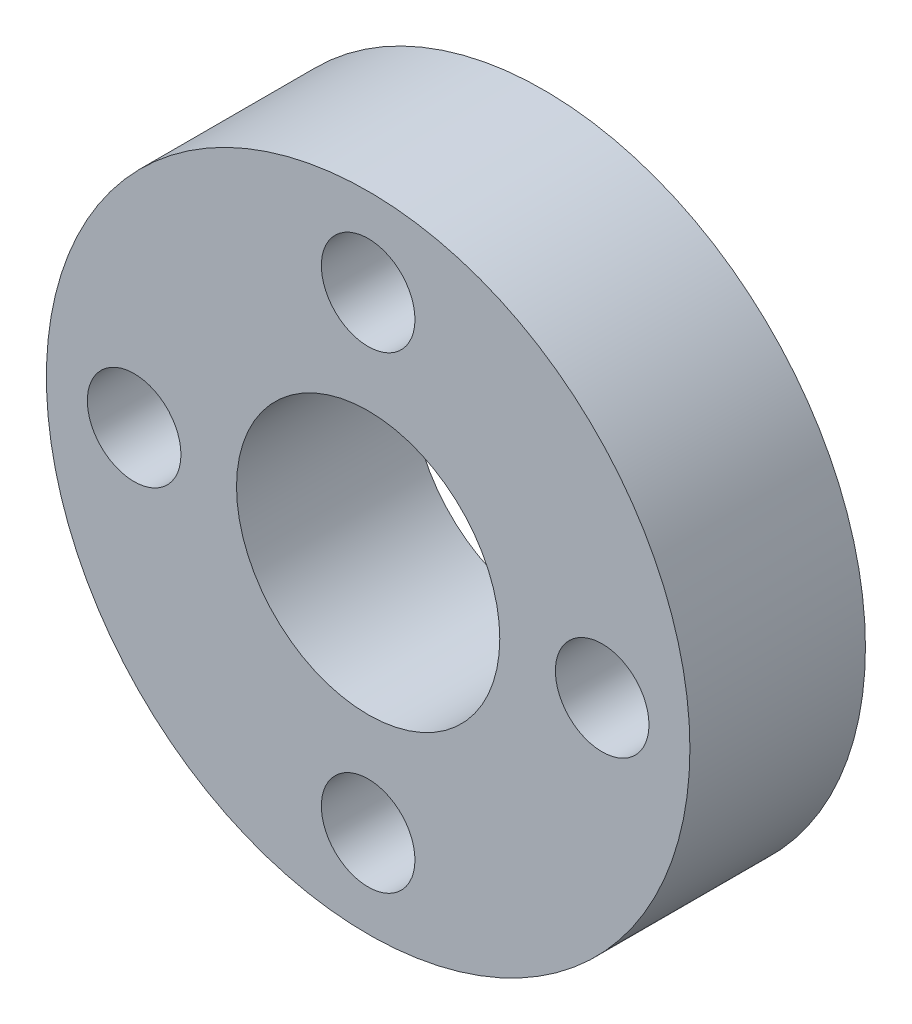
ISO-10303-21;
HEADER;
FILE_DESCRIPTION(('STEP AP214'),'2;1');
FILE_NAME('part.step','',(''),(''),'','','');
FILE_SCHEMA(('AUTOMOTIVE_DESIGN { 1 0 10303 214 1 1 1 1 }'));
ENDSEC;
DATA;
#1=APPLICATION_CONTEXT('core data for automotive mechanical design processes');
#2=APPLICATION_PROTOCOL_DEFINITION('international standard','automotive_design',2000,#1);
#3=PRODUCT_CONTEXT('',#1,'mechanical');
#4=PRODUCT('Part','Part','',(#3));
#5=PRODUCT_RELATED_PRODUCT_CATEGORY('part','',(#4));
#6=PRODUCT_DEFINITION_FORMATION('','',#4);
#7=PRODUCT_DEFINITION_CONTEXT('part definition',#1,'design');
#8=PRODUCT_DEFINITION('design','',#6,#7);
#9=PRODUCT_DEFINITION_SHAPE('','',#8);
#10=(LENGTH_UNIT() NAMED_UNIT(*) SI_UNIT(.MILLI.,.METRE.));
#11=(NAMED_UNIT(*) PLANE_ANGLE_UNIT() SI_UNIT($,.RADIAN.));
#12=(NAMED_UNIT(*) SI_UNIT($,.STERADIAN.) SOLID_ANGLE_UNIT());
#13=UNCERTAINTY_MEASURE_WITH_UNIT(LENGTH_MEASURE(1.E-05),#10,'distance_accuracy_value','');
#14=(GEOMETRIC_REPRESENTATION_CONTEXT(3) GLOBAL_UNCERTAINTY_ASSIGNED_CONTEXT((#13)) GLOBAL_UNIT_ASSIGNED_CONTEXT((#10,
#11,#12)) REPRESENTATION_CONTEXT('',''));
#15=CARTESIAN_POINT('',(0.,0.,0.));
#16=DIRECTION('',(0.,0.,1.));
#17=DIRECTION('',(1.,0.,0.));
#18=AXIS2_PLACEMENT_3D('',#15,#16,#17);
#19=CARTESIAN_POINT('',(0.,0.,6.));
#20=DIRECTION('',(0.,0.,1.));
#21=DIRECTION('',(1.,0.,0.));
#22=AXIS2_PLACEMENT_3D('',#19,#20,#21);
#23=PLANE('',#22);
#24=CARTESIAN_POINT('',(-8.,0.,6.));
#25=DIRECTION('',(0.,0.,1.));
#26=DIRECTION('',(1.,0.,0.));
#27=AXIS2_PLACEMENT_3D('',#24,#25,#26);
#28=CIRCLE('',#27,1.6);
#29=CARTESIAN_POINT('',(-6.4,0.,6.));
#30=VERTEX_POINT('',#29);
#31=EDGE_CURVE('E59',#30,#30,#28,.T.);
#32=ORIENTED_EDGE('',*,*,#31,.F.);
#33=EDGE_LOOP('',(#32));
#34=FACE_BOUND('',#33,.T.);
#35=CARTESIAN_POINT('',(8.,0.,6.));
#36=DIRECTION('',(0.,0.,1.));
#37=DIRECTION('',(1.,0.,0.));
#38=AXIS2_PLACEMENT_3D('',#35,#36,#37);
#39=CIRCLE('',#38,1.6);
#40=CARTESIAN_POINT('',(9.6,0.,6.));
#41=VERTEX_POINT('',#40);
#42=EDGE_CURVE('E47',#41,#41,#39,.T.);
#43=ORIENTED_EDGE('',*,*,#42,.F.);
#44=EDGE_LOOP('',(#43));
#45=FACE_BOUND('',#44,.T.);
#46=CARTESIAN_POINT('',(0.,0.,6.));
#47=DIRECTION('',(0.,0.,1.));
#48=DIRECTION('',(1.,0.,0.));
#49=AXIS2_PLACEMENT_3D('',#46,#47,#48);
#50=CIRCLE('',#49,11.);
#51=CARTESIAN_POINT('',(11.,0.,6.));
#52=VERTEX_POINT('',#51);
#53=EDGE_CURVE('E10',#52,#52,#50,.T.);
#54=ORIENTED_EDGE('',*,*,#53,.T.);
#55=EDGE_LOOP('',(#54));
#56=FACE_BOUND('',#55,.T.);
#57=CARTESIAN_POINT('',(0.,0.,6.));
#58=DIRECTION('',(0.,0.,1.));
#59=DIRECTION('',(1.,0.,0.));
#60=AXIS2_PLACEMENT_3D('',#57,#58,#59);
#61=CIRCLE('',#60,4.5);
#62=CARTESIAN_POINT('',(4.5,0.,6.));
#63=VERTEX_POINT('',#62);
#64=EDGE_CURVE('E42',#63,#63,#61,.T.);
#65=ORIENTED_EDGE('',*,*,#64,.F.);
#66=EDGE_LOOP('',(#65));
#67=FACE_BOUND('',#66,.T.);
#68=CARTESIAN_POINT('',(0.,8.,6.));
#69=DIRECTION('',(0.,0.,1.));
#70=DIRECTION('',(1.,0.,0.));
#71=AXIS2_PLACEMENT_3D('',#68,#69,#70);
#72=CIRCLE('',#71,1.6);
#73=CARTESIAN_POINT('',(1.6,8.,6.));
#74=VERTEX_POINT('',#73);
#75=EDGE_CURVE('E53',#74,#74,#72,.T.);
#76=ORIENTED_EDGE('',*,*,#75,.F.);
#77=EDGE_LOOP('',(#76));
#78=FACE_BOUND('',#77,.T.);
#79=CARTESIAN_POINT('',(0.,-8.,6.));
#80=DIRECTION('',(0.,0.,1.));
#81=DIRECTION('',(1.,0.,0.));
#82=AXIS2_PLACEMENT_3D('',#79,#80,#81);
#83=CIRCLE('',#82,1.6);
#84=CARTESIAN_POINT('',(1.6,-8.,6.));
#85=VERTEX_POINT('',#84);
#86=EDGE_CURVE('E65',#85,#85,#83,.T.);
#87=ORIENTED_EDGE('',*,*,#86,.F.);
#88=EDGE_LOOP('',(#87));
#89=FACE_BOUND('',#88,.T.);
#90=ADVANCED_FACE('F31',(#34,#45,#56,#67,#78,#89),#23,.T.);
#91=CARTESIAN_POINT('',(0.,0.,0.));
#92=DIRECTION('',(0.,0.,1.));
#93=DIRECTION('',(1.,0.,0.));
#94=AXIS2_PLACEMENT_3D('',#91,#92,#93);
#95=PLANE('',#94);
#96=CARTESIAN_POINT('',(0.,0.,0.));
#97=DIRECTION('',(0.,0.,1.));
#98=DIRECTION('',(1.,0.,0.));
#99=AXIS2_PLACEMENT_3D('',#96,#97,#98);
#100=CIRCLE('',#99,11.);
#101=CARTESIAN_POINT('',(11.,0.,0.));
#102=VERTEX_POINT('',#101);
#103=EDGE_CURVE('E35',#102,#102,#100,.T.);
#104=ORIENTED_EDGE('',*,*,#103,.F.);
#105=EDGE_LOOP('',(#104));
#106=FACE_BOUND('',#105,.T.);
#107=CARTESIAN_POINT('',(0.,0.,0.));
#108=DIRECTION('',(0.,0.,1.));
#109=DIRECTION('',(1.,0.,0.));
#110=AXIS2_PLACEMENT_3D('',#107,#108,#109);
#111=CIRCLE('',#110,4.5);
#112=CARTESIAN_POINT('',(4.5,0.,0.));
#113=VERTEX_POINT('',#112);
#114=EDGE_CURVE('E44',#113,#113,#111,.T.);
#115=ORIENTED_EDGE('',*,*,#114,.T.);
#116=EDGE_LOOP('',(#115));
#117=FACE_BOUND('',#116,.T.);
#118=CARTESIAN_POINT('',(8.,0.,0.));
#119=DIRECTION('',(0.,0.,1.));
#120=DIRECTION('',(1.,0.,0.));
#121=AXIS2_PLACEMENT_3D('',#118,#119,#120);
#122=CIRCLE('',#121,1.6);
#123=CARTESIAN_POINT('',(9.6,0.,0.));
#124=VERTEX_POINT('',#123);
#125=EDGE_CURVE('E50',#124,#124,#122,.T.);
#126=ORIENTED_EDGE('',*,*,#125,.T.);
#127=EDGE_LOOP('',(#126));
#128=FACE_BOUND('',#127,.T.);
#129=CARTESIAN_POINT('',(0.,8.,0.));
#130=DIRECTION('',(0.,0.,1.));
#131=DIRECTION('',(1.,0.,0.));
#132=AXIS2_PLACEMENT_3D('',#129,#130,#131);
#133=CIRCLE('',#132,1.6);
#134=CARTESIAN_POINT('',(1.6,8.,0.));
#135=VERTEX_POINT('',#134);
#136=EDGE_CURVE('E56',#135,#135,#133,.T.);
#137=ORIENTED_EDGE('',*,*,#136,.T.);
#138=EDGE_LOOP('',(#137));
#139=FACE_BOUND('',#138,.T.);
#140=CARTESIAN_POINT('',(-8.,0.,0.));
#141=DIRECTION('',(0.,0.,1.));
#142=DIRECTION('',(1.,0.,0.));
#143=AXIS2_PLACEMENT_3D('',#140,#141,#142);
#144=CIRCLE('',#143,1.6);
#145=CARTESIAN_POINT('',(-6.4,0.,0.));
#146=VERTEX_POINT('',#145);
#147=EDGE_CURVE('E62',#146,#146,#144,.T.);
#148=ORIENTED_EDGE('',*,*,#147,.T.);
#149=EDGE_LOOP('',(#148));
#150=FACE_BOUND('',#149,.T.);
#151=CARTESIAN_POINT('',(0.,-8.,0.));
#152=DIRECTION('',(0.,0.,1.));
#153=DIRECTION('',(1.,0.,0.));
#154=AXIS2_PLACEMENT_3D('',#151,#152,#153);
#155=CIRCLE('',#154,1.6);
#156=CARTESIAN_POINT('',(1.6,-8.,0.));
#157=VERTEX_POINT('',#156);
#158=EDGE_CURVE('E68',#157,#157,#155,.T.);
#159=ORIENTED_EDGE('',*,*,#158,.T.);
#160=EDGE_LOOP('',(#159));
#161=FACE_BOUND('',#160,.T.);
#162=ADVANCED_FACE('F78',(#106,#117,#128,#139,#150,#161),#95,.F.);
#163=CARTESIAN_POINT('',(0.,0.,6.));
#164=DIRECTION('',(0.,0.,-1.));
#165=DIRECTION('',(-1.,0.,0.));
#166=AXIS2_PLACEMENT_3D('',#163,#164,#165);
#167=CYLINDRICAL_SURFACE('',#166,11.);
#168=ORIENTED_EDGE('',*,*,#53,.F.);
#169=EDGE_LOOP('',(#168));
#170=FACE_BOUND('',#169,.T.);
#171=ORIENTED_EDGE('',*,*,#103,.T.);
#172=EDGE_LOOP('',(#171));
#173=FACE_BOUND('',#172,.T.);
#174=ADVANCED_FACE('F33',(#170,#173),#167,.T.);
#175=CARTESIAN_POINT('',(0.,0.,6.));
#176=DIRECTION('',(0.,0.,-1.));
#177=DIRECTION('',(-1.,0.,0.));
#178=AXIS2_PLACEMENT_3D('',#175,#176,#177);
#179=CYLINDRICAL_SURFACE('',#178,4.5);
#180=ORIENTED_EDGE('',*,*,#64,.T.);
#181=EDGE_LOOP('',(#180));
#182=FACE_BOUND('',#181,.T.);
#183=ORIENTED_EDGE('',*,*,#114,.F.);
#184=EDGE_LOOP('',(#183));
#185=FACE_BOUND('',#184,.T.);
#186=ADVANCED_FACE('F88',(#182,#185),#179,.F.);
#187=CARTESIAN_POINT('',(8.,0.,6.));
#188=DIRECTION('',(0.,0.,-1.));
#189=DIRECTION('',(-1.,0.,0.));
#190=AXIS2_PLACEMENT_3D('',#187,#188,#189);
#191=CYLINDRICAL_SURFACE('',#190,1.6);
#192=ORIENTED_EDGE('',*,*,#42,.T.);
#193=EDGE_LOOP('',(#192));
#194=FACE_BOUND('',#193,.T.);
#195=ORIENTED_EDGE('',*,*,#125,.F.);
#196=EDGE_LOOP('',(#195));
#197=FACE_BOUND('',#196,.T.);
#198=ADVANCED_FACE('F91',(#194,#197),#191,.F.);
#199=CARTESIAN_POINT('',(0.,8.,6.));
#200=DIRECTION('',(0.,0.,-1.));
#201=DIRECTION('',(-1.,0.,0.));
#202=AXIS2_PLACEMENT_3D('',#199,#200,#201);
#203=CYLINDRICAL_SURFACE('',#202,1.6);
#204=ORIENTED_EDGE('',*,*,#75,.T.);
#205=EDGE_LOOP('',(#204));
#206=FACE_BOUND('',#205,.T.);
#207=ORIENTED_EDGE('',*,*,#136,.F.);
#208=EDGE_LOOP('',(#207));
#209=FACE_BOUND('',#208,.T.);
#210=ADVANCED_FACE('F95',(#206,#209),#203,.F.);
#211=CARTESIAN_POINT('',(-8.,0.,6.));
#212=DIRECTION('',(0.,0.,-1.));
#213=DIRECTION('',(-1.,0.,0.));
#214=AXIS2_PLACEMENT_3D('',#211,#212,#213);
#215=CYLINDRICAL_SURFACE('',#214,1.6);
#216=ORIENTED_EDGE('',*,*,#31,.T.);
#217=EDGE_LOOP('',(#216));
#218=FACE_BOUND('',#217,.T.);
#219=ORIENTED_EDGE('',*,*,#147,.F.);
#220=EDGE_LOOP('',(#219));
#221=FACE_BOUND('',#220,.T.);
#222=ADVANCED_FACE('F99',(#218,#221),#215,.F.);
#223=CARTESIAN_POINT('',(0.,-8.,6.));
#224=DIRECTION('',(0.,0.,-1.));
#225=DIRECTION('',(-1.,0.,0.));
#226=AXIS2_PLACEMENT_3D('',#223,#224,#225);
#227=CYLINDRICAL_SURFACE('',#226,1.6);
#228=ORIENTED_EDGE('',*,*,#86,.T.);
#229=EDGE_LOOP('',(#228));
#230=FACE_BOUND('',#229,.T.);
#231=ORIENTED_EDGE('',*,*,#158,.F.);
#232=EDGE_LOOP('',(#231));
#233=FACE_BOUND('',#232,.T.);
#234=ADVANCED_FACE('F74',(#230,#233),#227,.F.);
#235=CLOSED_SHELL('',(#90,#162,#174,#186,#198,#210,#222,#234));
#236=MANIFOLD_SOLID_BREP('B2',#235);
#237=ADVANCED_BREP_SHAPE_REPRESENTATION('',(#18,#236),#14);
#238=SHAPE_DEFINITION_REPRESENTATION(#9,#237);
ENDSEC;
END-ISO-10303-21;
